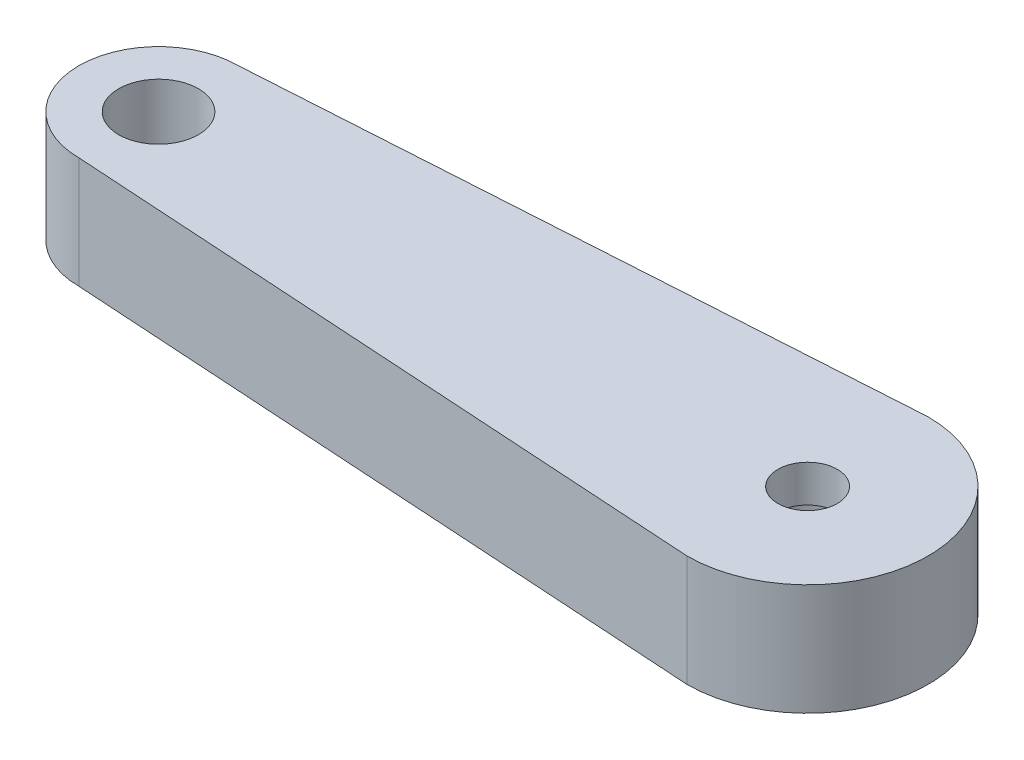
ISO-10303-21;
HEADER;
FILE_DESCRIPTION(('STEP AP214'),'2;1');
FILE_NAME('part.step','',(''),(''),'','','');
FILE_SCHEMA(('AUTOMOTIVE_DESIGN { 1 0 10303 214 1 1 1 1 }'));
ENDSEC;
DATA;
#1=APPLICATION_CONTEXT('core data for automotive mechanical design processes');
#2=APPLICATION_PROTOCOL_DEFINITION('international standard','automotive_design',2000,#1);
#3=PRODUCT_CONTEXT('',#1,'mechanical');
#4=PRODUCT('Part','Part','',(#3));
#5=PRODUCT_RELATED_PRODUCT_CATEGORY('part','',(#4));
#6=PRODUCT_DEFINITION_FORMATION('','',#4);
#7=PRODUCT_DEFINITION_CONTEXT('part definition',#1,'design');
#8=PRODUCT_DEFINITION('design','',#6,#7);
#9=PRODUCT_DEFINITION_SHAPE('','',#8);
#10=(LENGTH_UNIT() NAMED_UNIT(*) SI_UNIT(.MILLI.,.METRE.));
#11=(NAMED_UNIT(*) PLANE_ANGLE_UNIT() SI_UNIT($,.RADIAN.));
#12=(NAMED_UNIT(*) SI_UNIT($,.STERADIAN.) SOLID_ANGLE_UNIT());
#13=UNCERTAINTY_MEASURE_WITH_UNIT(LENGTH_MEASURE(1.E-05),#10,'distance_accuracy_value','');
#14=(GEOMETRIC_REPRESENTATION_CONTEXT(3) GLOBAL_UNCERTAINTY_ASSIGNED_CONTEXT((#13)) GLOBAL_UNIT_ASSIGNED_CONTEXT((#10,
#11,#12)) REPRESENTATION_CONTEXT('',''));
#15=CARTESIAN_POINT('',(0.,0.,0.));
#16=DIRECTION('',(0.,0.,1.));
#17=DIRECTION('',(1.,0.,0.));
#18=AXIS2_PLACEMENT_3D('',#15,#16,#17);
#19=CARTESIAN_POINT('',(-35.,6.,0.));
#20=DIRECTION('',(0.,-1.,0.));
#21=DIRECTION('',(0.,0.,-1.));
#22=AXIS2_PLACEMENT_3D('',#19,#20,#21);
#23=CYLINDRICAL_SURFACE('',#22,4.3);
#24=CARTESIAN_POINT('',(-35.,0.,0.));
#25=DIRECTION('',(0.,1.,0.));
#26=DIRECTION('',(0.,0.,1.));
#27=AXIS2_PLACEMENT_3D('',#24,#25,#26);
#28=CIRCLE('',#27,4.3);
#29=CARTESIAN_POINT('',(-35.,0.,-4.3));
#30=VERTEX_POINT('',#29);
#31=CARTESIAN_POINT('',(-35.,0.,4.3));
#32=VERTEX_POINT('',#31);
#33=EDGE_CURVE('E115',#30,#32,#28,.T.);
#34=ORIENTED_EDGE('',*,*,#33,.T.);
#35=DIRECTION('',(0.,-1.,0.));
#36=VECTOR('',#35,1.);
#37=CARTESIAN_POINT('',(-35.,6.,4.3));
#38=LINE('',#37,#36);
#39=CARTESIAN_POINT('',(-35.,6.,4.3));
#40=VERTEX_POINT('',#39);
#41=EDGE_CURVE('E11',#40,#32,#38,.T.);
#42=ORIENTED_EDGE('',*,*,#41,.F.);
#43=CARTESIAN_POINT('',(-35.,6.,0.));
#44=DIRECTION('',(0.,1.,0.));
#45=DIRECTION('',(0.,0.,1.));
#46=AXIS2_PLACEMENT_3D('',#43,#44,#45);
#47=CIRCLE('',#46,4.3);
#48=CARTESIAN_POINT('',(-35.,6.,-4.3));
#49=VERTEX_POINT('',#48);
#50=EDGE_CURVE('E96',#49,#40,#47,.T.);
#51=ORIENTED_EDGE('',*,*,#50,.F.);
#52=DIRECTION('',(0.,-1.,0.));
#53=VECTOR('',#52,1.);
#54=CARTESIAN_POINT('',(-35.,6.,-4.3));
#55=LINE('',#54,#53);
#56=EDGE_CURVE('E63',#49,#30,#55,.T.);
#57=ORIENTED_EDGE('',*,*,#56,.T.);
#58=EDGE_LOOP('',(#34,#42,#51,#57));
#59=FACE_BOUND('',#58,.T.);
#60=ADVANCED_FACE('F45',(#59),#23,.T.);
#61=CARTESIAN_POINT('',(-35.,6.,4.3));
#62=DIRECTION('',(0.0627333346859308,0.,-0.9980303245489));
#63=DIRECTION('',(-0.9980303245489,0.,-0.0627333346859309));
#64=AXIS2_PLACEMENT_3D('',#61,#62,#63);
#65=PLANE('',#64);
#66=DIRECTION('',(0.9980303245489,0.,0.0627333346859309));
#67=VECTOR('',#66,1.);
#68=CARTESIAN_POINT('',(-35.,0.,4.3));
#69=LINE('',#68,#67);
#70=CARTESIAN_POINT('',(0.,0.,6.5));
#71=VERTEX_POINT('',#70);
#72=EDGE_CURVE('E102',#32,#71,#69,.T.);
#73=ORIENTED_EDGE('',*,*,#72,.T.);
#74=DIRECTION('',(0.,-1.,0.));
#75=VECTOR('',#74,1.);
#76=CARTESIAN_POINT('',(0.,6.,6.5));
#77=LINE('',#76,#75);
#78=CARTESIAN_POINT('',(0.,6.,6.5));
#79=VERTEX_POINT('',#78);
#80=EDGE_CURVE('E55',#79,#71,#77,.T.);
#81=ORIENTED_EDGE('',*,*,#80,.F.);
#82=DIRECTION('',(0.9980303245489,0.,0.0627333346859309));
#83=VECTOR('',#82,1.);
#84=CARTESIAN_POINT('',(-35.,6.,4.3));
#85=LINE('',#84,#83);
#86=EDGE_CURVE('E88',#40,#79,#85,.T.);
#87=ORIENTED_EDGE('',*,*,#86,.F.);
#88=ORIENTED_EDGE('',*,*,#41,.T.);
#89=EDGE_LOOP('',(#73,#81,#87,#88));
#90=FACE_BOUND('',#89,.T.);
#91=ADVANCED_FACE('F101',(#90),#65,.F.);
#92=CARTESIAN_POINT('',(0.,6.,0.));
#93=DIRECTION('',(0.,-1.,0.));
#94=DIRECTION('',(0.,0.,-1.));
#95=AXIS2_PLACEMENT_3D('',#92,#93,#94);
#96=CYLINDRICAL_SURFACE('',#95,6.5);
#97=CARTESIAN_POINT('',(0.,0.,0.));
#98=DIRECTION('',(0.,-1.,0.));
#99=DIRECTION('',(0.,0.,-1.));
#100=AXIS2_PLACEMENT_3D('',#97,#98,#99);
#101=CIRCLE('',#100,6.5);
#102=CARTESIAN_POINT('',(0.,0.,-6.5));
#103=VERTEX_POINT('',#102);
#104=EDGE_CURVE('E121',#103,#71,#101,.T.);
#105=ORIENTED_EDGE('',*,*,#104,.F.);
#106=DIRECTION('',(0.,-1.,0.));
#107=VECTOR('',#106,1.);
#108=CARTESIAN_POINT('',(0.,6.,-6.5));
#109=LINE('',#108,#107);
#110=CARTESIAN_POINT('',(0.,6.,-6.5));
#111=VERTEX_POINT('',#110);
#112=EDGE_CURVE('E77',#111,#103,#109,.T.);
#113=ORIENTED_EDGE('',*,*,#112,.F.);
#114=CARTESIAN_POINT('',(0.,6.,0.));
#115=DIRECTION('',(0.,-1.,0.));
#116=DIRECTION('',(0.,0.,-1.));
#117=AXIS2_PLACEMENT_3D('',#114,#115,#116);
#118=CIRCLE('',#117,6.5);
#119=EDGE_CURVE('E95',#111,#79,#118,.T.);
#120=ORIENTED_EDGE('',*,*,#119,.T.);
#121=ORIENTED_EDGE('',*,*,#80,.T.);
#122=EDGE_LOOP('',(#105,#113,#120,#121));
#123=FACE_BOUND('',#122,.T.);
#124=ADVANCED_FACE('F107',(#123),#96,.T.);
#125=CARTESIAN_POINT('',(-35.,6.,-4.3));
#126=DIRECTION('',(-0.0627333346859308,0.,-0.9980303245489));
#127=DIRECTION('',(-0.9980303245489,0.,0.0627333346859309));
#128=AXIS2_PLACEMENT_3D('',#125,#126,#127);
#129=PLANE('',#128);
#130=DIRECTION('',(0.9980303245489,0.,-0.0627333346859309));
#131=VECTOR('',#130,1.);
#132=CARTESIAN_POINT('',(-35.,0.,-4.3));
#133=LINE('',#132,#131);
#134=EDGE_CURVE('E124',#30,#103,#133,.T.);
#135=ORIENTED_EDGE('',*,*,#134,.F.);
#136=ORIENTED_EDGE('',*,*,#56,.F.);
#137=DIRECTION('',(0.9980303245489,0.,-0.0627333346859309));
#138=VECTOR('',#137,1.);
#139=CARTESIAN_POINT('',(-35.,6.,-4.3));
#140=LINE('',#139,#138);
#141=EDGE_CURVE('E109',#49,#111,#140,.T.);
#142=ORIENTED_EDGE('',*,*,#141,.T.);
#143=ORIENTED_EDGE('',*,*,#112,.T.);
#144=EDGE_LOOP('',(#135,#136,#142,#143));
#145=FACE_BOUND('',#144,.T.);
#146=ADVANCED_FACE('F178',(#145),#129,.T.);
#147=CARTESIAN_POINT('',(-35.,6.,0.));
#148=DIRECTION('',(0.,1.,0.));
#149=DIRECTION('',(0.,0.,1.));
#150=AXIS2_PLACEMENT_3D('',#147,#148,#149);
#151=PLANE('',#150);
#152=CARTESIAN_POINT('',(0.,6.,0.));
#153=DIRECTION('',(0.,1.,0.));
#154=DIRECTION('',(0.,0.,1.));
#155=AXIS2_PLACEMENT_3D('',#152,#153,#154);
#156=CIRCLE('',#155,1.6);
#157=CARTESIAN_POINT('',(0.,6.,1.6));
#158=VERTEX_POINT('',#157);
#159=EDGE_CURVE('E146',#158,#158,#156,.F.);
#160=ORIENTED_EDGE('',*,*,#159,.T.);
#161=EDGE_LOOP('',(#160));
#162=FACE_BOUND('',#161,.T.);
#163=CARTESIAN_POINT('',(-35.,6.,0.));
#164=DIRECTION('',(0.,1.,0.));
#165=DIRECTION('',(0.,0.,1.));
#166=AXIS2_PLACEMENT_3D('',#163,#164,#165);
#167=CIRCLE('',#166,2.15);
#168=CARTESIAN_POINT('',(-35.,6.,2.15));
#169=VERTEX_POINT('',#168);
#170=EDGE_CURVE('E118',#169,#169,#167,.T.);
#171=ORIENTED_EDGE('',*,*,#170,.F.);
#172=EDGE_LOOP('',(#171));
#173=FACE_BOUND('',#172,.T.);
#174=ORIENTED_EDGE('',*,*,#50,.T.);
#175=ORIENTED_EDGE('',*,*,#86,.T.);
#176=ORIENTED_EDGE('',*,*,#119,.F.);
#177=ORIENTED_EDGE('',*,*,#141,.F.);
#178=EDGE_LOOP('',(#174,#175,#176,#177));
#179=FACE_BOUND('',#178,.T.);
#180=ADVANCED_FACE('F92',(#162,#173,#179),#151,.T.);
#181=CARTESIAN_POINT('',(-35.,0.,0.));
#182=DIRECTION('',(0.,1.,0.));
#183=DIRECTION('',(0.,0.,1.));
#184=AXIS2_PLACEMENT_3D('',#181,#182,#183);
#185=PLANE('',#184);
#186=CARTESIAN_POINT('',(0.,0.,0.));
#187=DIRECTION('',(0.,1.,0.));
#188=DIRECTION('',(0.,0.,1.));
#189=AXIS2_PLACEMENT_3D('',#186,#187,#188);
#190=CIRCLE('',#189,2.95);
#191=CARTESIAN_POINT('',(0.,0.,2.95));
#192=VERTEX_POINT('',#191);
#193=EDGE_CURVE('E142',#192,#192,#190,.T.);
#194=ORIENTED_EDGE('',*,*,#193,.T.);
#195=EDGE_LOOP('',(#194));
#196=FACE_BOUND('',#195,.T.);
#197=CARTESIAN_POINT('',(-35.,0.,0.));
#198=DIRECTION('',(0.,1.,0.));
#199=DIRECTION('',(0.,0.,1.));
#200=AXIS2_PLACEMENT_3D('',#197,#198,#199);
#201=CIRCLE('',#200,2.15);
#202=CARTESIAN_POINT('',(-35.,0.,2.15));
#203=VERTEX_POINT('',#202);
#204=EDGE_CURVE('E134',#203,#203,#201,.T.);
#205=ORIENTED_EDGE('',*,*,#204,.T.);
#206=EDGE_LOOP('',(#205));
#207=FACE_BOUND('',#206,.T.);
#208=ORIENTED_EDGE('',*,*,#33,.F.);
#209=ORIENTED_EDGE('',*,*,#134,.T.);
#210=ORIENTED_EDGE('',*,*,#104,.T.);
#211=ORIENTED_EDGE('',*,*,#72,.F.);
#212=EDGE_LOOP('',(#208,#209,#210,#211));
#213=FACE_BOUND('',#212,.T.);
#214=ADVANCED_FACE('F173',(#196,#207,#213),#185,.F.);
#215=CARTESIAN_POINT('',(-35.,6.,0.));
#216=DIRECTION('',(0.,-1.,0.));
#217=DIRECTION('',(0.,0.,-1.));
#218=AXIS2_PLACEMENT_3D('',#215,#216,#217);
#219=CYLINDRICAL_SURFACE('',#218,2.15);
#220=ORIENTED_EDGE('',*,*,#170,.T.);
#221=EDGE_LOOP('',(#220));
#222=FACE_BOUND('',#221,.T.);
#223=ORIENTED_EDGE('',*,*,#204,.F.);
#224=EDGE_LOOP('',(#223));
#225=FACE_BOUND('',#224,.T.);
#226=ADVANCED_FACE('F169',(#222,#225),#219,.F.);
#227=CARTESIAN_POINT('',(0.,4.,0.));
#228=DIRECTION('',(0.,-1.,0.));
#229=DIRECTION('',(0.,0.,-1.));
#230=AXIS2_PLACEMENT_3D('',#227,#228,#229);
#231=CYLINDRICAL_SURFACE('',#230,2.95);
#232=CARTESIAN_POINT('',(0.,4.,0.));
#233=DIRECTION('',(0.,1.,0.));
#234=DIRECTION('',(0.,0.,1.));
#235=AXIS2_PLACEMENT_3D('',#232,#233,#234);
#236=CIRCLE('',#235,2.95);
#237=CARTESIAN_POINT('',(0.,4.,2.95));
#238=VERTEX_POINT('',#237);
#239=EDGE_CURVE('E138',#238,#238,#236,.T.);
#240=ORIENTED_EDGE('',*,*,#239,.T.);
#241=EDGE_LOOP('',(#240));
#242=FACE_BOUND('',#241,.T.);
#243=ORIENTED_EDGE('',*,*,#193,.F.);
#244=EDGE_LOOP('',(#243));
#245=FACE_BOUND('',#244,.T.);
#246=ADVANCED_FACE('F163',(#242,#245),#231,.F.);
#247=CARTESIAN_POINT('',(0.,4.,0.));
#248=DIRECTION('',(0.,1.,0.));
#249=DIRECTION('',(0.,0.,1.));
#250=AXIS2_PLACEMENT_3D('',#247,#248,#249);
#251=PLANE('',#250);
#252=CARTESIAN_POINT('',(0.,4.,0.));
#253=DIRECTION('',(0.,1.,0.));
#254=DIRECTION('',(0.,0.,1.));
#255=AXIS2_PLACEMENT_3D('',#252,#253,#254);
#256=CIRCLE('',#255,1.6);
#257=CARTESIAN_POINT('',(0.,4.,1.6));
#258=VERTEX_POINT('',#257);
#259=EDGE_CURVE('E48',#258,#258,#256,.F.);
#260=ORIENTED_EDGE('',*,*,#259,.F.);
#261=EDGE_LOOP('',(#260));
#262=FACE_BOUND('',#261,.T.);
#263=ORIENTED_EDGE('',*,*,#239,.F.);
#264=EDGE_LOOP('',(#263));
#265=FACE_BOUND('',#264,.T.);
#266=ADVANCED_FACE('F160',(#262,#265),#251,.F.);
#267=CARTESIAN_POINT('',(0.,11.,0.));
#268=DIRECTION('',(0.,-1.,0.));
#269=DIRECTION('',(0.,0.,-1.));
#270=AXIS2_PLACEMENT_3D('',#267,#268,#269);
#271=CYLINDRICAL_SURFACE('',#270,1.6);
#272=ORIENTED_EDGE('',*,*,#159,.F.);
#273=EDGE_LOOP('',(#272));
#274=FACE_BOUND('',#273,.T.);
#275=ORIENTED_EDGE('',*,*,#259,.T.);
#276=EDGE_LOOP('',(#275));
#277=FACE_BOUND('',#276,.T.);
#278=ADVANCED_FACE('F158',(#274,#277),#271,.F.);
#279=CLOSED_SHELL('',(#60,#91,#124,#146,#180,#214,#226,#246,#266,#278));
#280=MANIFOLD_SOLID_BREP('B2',#279);
#281=ADVANCED_BREP_SHAPE_REPRESENTATION('',(#18,#280),#14);
#282=SHAPE_DEFINITION_REPRESENTATION(#9,#281);
ENDSEC;
END-ISO-10303-21;
